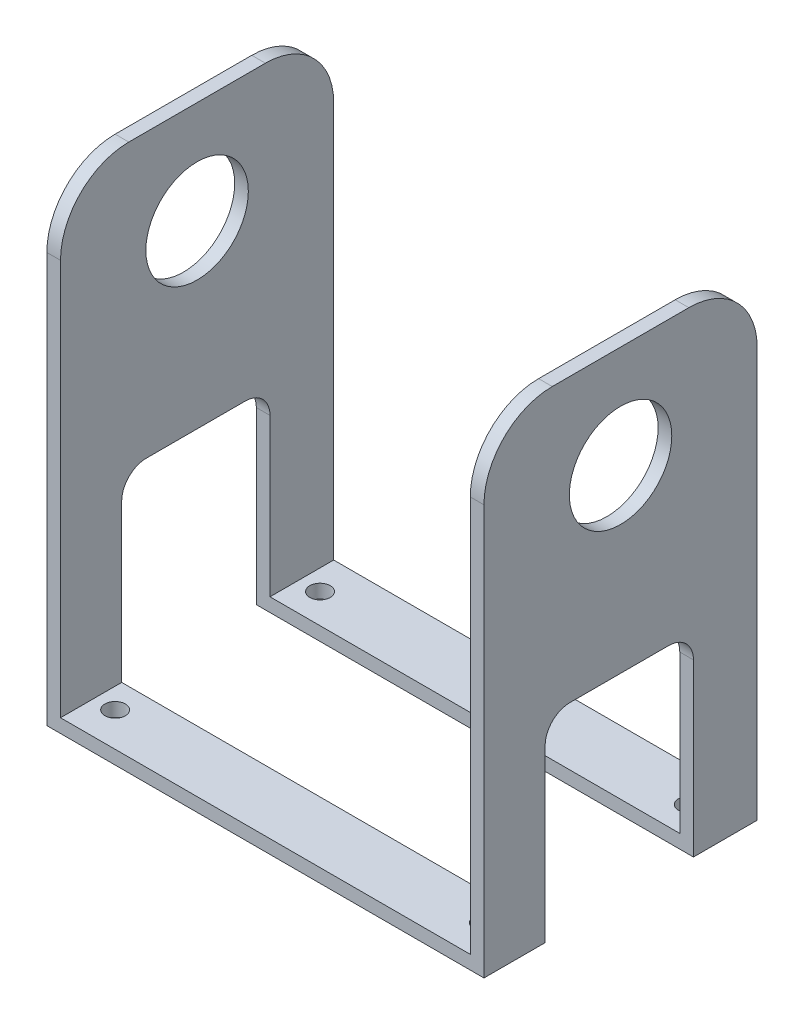
ISO-10303-21;
HEADER;
FILE_DESCRIPTION(('STEP AP214'),'2;1');
FILE_NAME('part.step','',(''),(''),'','','');
FILE_SCHEMA(('AUTOMOTIVE_DESIGN { 1 0 10303 214 1 1 1 1 }'));
ENDSEC;
DATA;
#1=APPLICATION_CONTEXT('core data for automotive mechanical design processes');
#2=APPLICATION_PROTOCOL_DEFINITION('international standard','automotive_design',2000,#1);
#3=PRODUCT_CONTEXT('',#1,'mechanical');
#4=PRODUCT('Part','Part','',(#3));
#5=PRODUCT_RELATED_PRODUCT_CATEGORY('part','',(#4));
#6=PRODUCT_DEFINITION_FORMATION('','',#4);
#7=PRODUCT_DEFINITION_CONTEXT('part definition',#1,'design');
#8=PRODUCT_DEFINITION('design','',#6,#7);
#9=PRODUCT_DEFINITION_SHAPE('','',#8);
#10=(LENGTH_UNIT() NAMED_UNIT(*) SI_UNIT(.MILLI.,.METRE.));
#11=(NAMED_UNIT(*) PLANE_ANGLE_UNIT() SI_UNIT($,.RADIAN.));
#12=(NAMED_UNIT(*) SI_UNIT($,.STERADIAN.) SOLID_ANGLE_UNIT());
#13=UNCERTAINTY_MEASURE_WITH_UNIT(LENGTH_MEASURE(1.E-05),#10,'distance_accuracy_value','');
#14=(GEOMETRIC_REPRESENTATION_CONTEXT(3) GLOBAL_UNCERTAINTY_ASSIGNED_CONTEXT((#13)) GLOBAL_UNIT_ASSIGNED_CONTEXT((#10,
#11,#12)) REPRESENTATION_CONTEXT('',''));
#15=CARTESIAN_POINT('',(0.,0.,0.));
#16=DIRECTION('',(0.,0.,1.));
#17=DIRECTION('',(1.,0.,0.));
#18=AXIS2_PLACEMENT_3D('',#15,#16,#17);
#19=CARTESIAN_POINT('',(0.,0.,40.));
#20=DIRECTION('',(-1.,0.,0.));
#21=DIRECTION('',(0.,0.,1.));
#22=AXIS2_PLACEMENT_3D('',#19,#20,#21);
#23=PLANE('',#22);
#24=CARTESIAN_POINT('',(0.,55.,20.));
#25=DIRECTION('',(1.,0.,0.));
#26=DIRECTION('',(0.,0.,-1.));
#27=AXIS2_PLACEMENT_3D('',#24,#25,#26);
#28=CIRCLE('',#27,7.5);
#29=CARTESIAN_POINT('',(0.,55.,12.5));
#30=VERTEX_POINT('',#29);
#31=EDGE_CURVE('E324',#30,#30,#28,.T.);
#32=ORIENTED_EDGE('',*,*,#31,.F.);
#33=EDGE_LOOP('',(#32));
#34=FACE_BOUND('',#33,.T.);
#35=DIRECTION('',(0.,1.,0.));
#36=VECTOR('',#35,1.);
#37=CARTESIAN_POINT('',(0.,0.,0.));
#38=LINE('',#37,#36);
#39=CARTESIAN_POINT('',(0.,0.,0.));
#40=VERTEX_POINT('',#39);
#41=CARTESIAN_POINT('',(0.,60.,0.));
#42=VERTEX_POINT('',#41);
#43=EDGE_CURVE('E339',#40,#42,#38,.T.);
#44=ORIENTED_EDGE('',*,*,#43,.T.);
#45=CARTESIAN_POINT('',(0.,60.,10.));
#46=DIRECTION('',(-1.,0.,0.));
#47=DIRECTION('',(0.,0.,1.));
#48=AXIS2_PLACEMENT_3D('',#45,#46,#47);
#49=CIRCLE('',#48,10.);
#50=CARTESIAN_POINT('',(0.,70.,10.));
#51=VERTEX_POINT('',#50);
#52=EDGE_CURVE('E381',#42,#51,#49,.F.);
#53=ORIENTED_EDGE('',*,*,#52,.T.);
#54=DIRECTION('',(0.,0.,-1.));
#55=VECTOR('',#54,1.);
#56=CARTESIAN_POINT('',(0.,70.,40.));
#57=LINE('',#56,#55);
#58=CARTESIAN_POINT('',(0.,70.,30.));
#59=VERTEX_POINT('',#58);
#60=EDGE_CURVE('E359',#59,#51,#57,.T.);
#61=ORIENTED_EDGE('',*,*,#60,.F.);
#62=CARTESIAN_POINT('',(0.,60.,30.));
#63=DIRECTION('',(-1.,0.,0.));
#64=DIRECTION('',(0.,0.,1.));
#65=AXIS2_PLACEMENT_3D('',#62,#63,#64);
#66=CIRCLE('',#65,10.);
#67=CARTESIAN_POINT('',(0.,60.,40.));
#68=VERTEX_POINT('',#67);
#69=EDGE_CURVE('E379',#59,#68,#66,.F.);
#70=ORIENTED_EDGE('',*,*,#69,.T.);
#71=DIRECTION('',(0.,1.,0.));
#72=VECTOR('',#71,1.);
#73=CARTESIAN_POINT('',(0.,0.,40.));
#74=LINE('',#73,#72);
#75=CARTESIAN_POINT('',(0.,0.,40.));
#76=VERTEX_POINT('',#75);
#77=EDGE_CURVE('E328',#76,#68,#74,.T.);
#78=ORIENTED_EDGE('',*,*,#77,.F.);
#79=DIRECTION('',(0.,0.,-1.));
#80=VECTOR('',#79,1.);
#81=CARTESIAN_POINT('',(0.,0.,40.));
#82=LINE('',#81,#80);
#83=CARTESIAN_POINT('',(0.,0.,31.0394527120361));
#84=VERTEX_POINT('',#83);
#85=EDGE_CURVE('E350',#76,#84,#82,.T.);
#86=ORIENTED_EDGE('',*,*,#85,.T.);
#87=DIRECTION('',(0.,1.,0.));
#88=VECTOR('',#87,1.);
#89=CARTESIAN_POINT('',(0.,0.,31.0394527120361));
#90=LINE('',#89,#88);
#91=CARTESIAN_POINT('',(0.,25.,31.0394527120361));
#92=VERTEX_POINT('',#91);
#93=EDGE_CURVE('E304',#84,#92,#90,.T.);
#94=ORIENTED_EDGE('',*,*,#93,.T.);
#95=CARTESIAN_POINT('',(0.,25.,27.4106744023088));
#96=DIRECTION('',(-1.,0.,0.));
#97=DIRECTION('',(0.,0.,1.));
#98=AXIS2_PLACEMENT_3D('',#95,#96,#97);
#99=CIRCLE('',#98,3.62877830972729);
#100=CARTESIAN_POINT('',(0.,28.6287783097273,27.4106744023088));
#101=VERTEX_POINT('',#100);
#102=EDGE_CURVE('E301',#92,#101,#99,.T.);
#103=ORIENTED_EDGE('',*,*,#102,.T.);
#104=DIRECTION('',(0.,0.,-1.));
#105=VECTOR('',#104,1.);
#106=CARTESIAN_POINT('',(0.,28.6287783097273,27.4106744023088));
#107=LINE('',#106,#105);
#108=CARTESIAN_POINT('',(0.,28.6287783097273,12.9564492245383));
#109=VERTEX_POINT('',#108);
#110=EDGE_CURVE('E298',#101,#109,#107,.T.);
#111=ORIENTED_EDGE('',*,*,#110,.T.);
#112=CARTESIAN_POINT('',(0.,25.,12.9564492245383));
#113=DIRECTION('',(-1.,0.,0.));
#114=DIRECTION('',(0.,0.,1.));
#115=AXIS2_PLACEMENT_3D('',#112,#113,#114);
#116=CIRCLE('',#115,3.62877830972729);
#117=CARTESIAN_POINT('',(0.,25.,9.32767091481105));
#118=VERTEX_POINT('',#117);
#119=EDGE_CURVE('E310',#109,#118,#116,.T.);
#120=ORIENTED_EDGE('',*,*,#119,.T.);
#121=DIRECTION('',(0.,-1.,0.));
#122=VECTOR('',#121,1.);
#123=CARTESIAN_POINT('',(0.,25.,9.32767091481105));
#124=LINE('',#123,#122);
#125=CARTESIAN_POINT('',(0.,0.,9.32767091481105));
#126=VERTEX_POINT('',#125);
#127=EDGE_CURVE('E307',#118,#126,#124,.T.);
#128=ORIENTED_EDGE('',*,*,#127,.T.);
#129=EDGE_CURVE('E338',#126,#40,#82,.T.);
#130=ORIENTED_EDGE('',*,*,#129,.T.);
#131=EDGE_LOOP('',(#44,#53,#61,#70,#78,#86,#94,#103,#111,#120,#128,#130));
#132=FACE_BOUND('',#131,.T.);
#133=ADVANCED_FACE('F32',(#34,#132),#23,.F.);
#134=CARTESIAN_POINT('',(-2.,0.,40.));
#135=DIRECTION('',(-1.,0.,0.));
#136=DIRECTION('',(0.,0.,1.));
#137=AXIS2_PLACEMENT_3D('',#134,#135,#136);
#138=PLANE('',#137);
#139=CARTESIAN_POINT('',(-2.,55.,20.));
#140=DIRECTION('',(-1.,0.,0.));
#141=DIRECTION('',(0.,0.,1.));
#142=AXIS2_PLACEMENT_3D('',#139,#140,#141);
#143=CIRCLE('',#142,7.5);
#144=CARTESIAN_POINT('',(-2.,55.,27.5));
#145=VERTEX_POINT('',#144);
#146=EDGE_CURVE('E327',#145,#145,#143,.T.);
#147=ORIENTED_EDGE('',*,*,#146,.F.);
#148=EDGE_LOOP('',(#147));
#149=FACE_BOUND('',#148,.T.);
#150=DIRECTION('',(0.,0.,-1.));
#151=VECTOR('',#150,1.);
#152=CARTESIAN_POINT('',(-2.,70.,40.));
#153=LINE('',#152,#151);
#154=CARTESIAN_POINT('',(-2.,70.,30.));
#155=VERTEX_POINT('',#154);
#156=CARTESIAN_POINT('',(-2.,70.,10.));
#157=VERTEX_POINT('',#156);
#158=EDGE_CURVE('E357',#155,#157,#153,.T.);
#159=ORIENTED_EDGE('',*,*,#158,.T.);
#160=CARTESIAN_POINT('',(-2.,60.,10.));
#161=DIRECTION('',(-1.,0.,0.));
#162=DIRECTION('',(0.,0.,1.));
#163=AXIS2_PLACEMENT_3D('',#160,#161,#162);
#164=CIRCLE('',#163,10.);
#165=CARTESIAN_POINT('',(-2.,60.,0.));
#166=VERTEX_POINT('',#165);
#167=EDGE_CURVE('E40',#157,#166,#164,.T.);
#168=ORIENTED_EDGE('',*,*,#167,.T.);
#169=DIRECTION('',(0.,1.,0.));
#170=VECTOR('',#169,1.);
#171=CARTESIAN_POINT('',(-2.,0.,0.));
#172=LINE('',#171,#170);
#173=CARTESIAN_POINT('',(-2.,2.,0.));
#174=VERTEX_POINT('',#173);
#175=EDGE_CURVE('E342',#174,#166,#172,.T.);
#176=ORIENTED_EDGE('',*,*,#175,.F.);
#177=DIRECTION('',(0.,0.,-1.));
#178=VECTOR('',#177,1.);
#179=CARTESIAN_POINT('',(-2.,2.,40.));
#180=LINE('',#179,#178);
#181=CARTESIAN_POINT('',(-2.,2.,9.32767091481105));
#182=VERTEX_POINT('',#181);
#183=EDGE_CURVE('E353',#182,#174,#180,.T.);
#184=ORIENTED_EDGE('',*,*,#183,.F.);
#185=DIRECTION('',(0.,1.,0.));
#186=VECTOR('',#185,1.);
#187=CARTESIAN_POINT('',(-2.,0.,9.32767091481105));
#188=LINE('',#187,#186);
#189=CARTESIAN_POINT('',(-2.,25.,9.32767091481105));
#190=VERTEX_POINT('',#189);
#191=EDGE_CURVE('E321',#182,#190,#188,.T.);
#192=ORIENTED_EDGE('',*,*,#191,.T.);
#193=CARTESIAN_POINT('',(-2.,25.,12.9564492245383));
#194=DIRECTION('',(-1.,0.,0.));
#195=DIRECTION('',(0.,0.,1.));
#196=AXIS2_PLACEMENT_3D('',#193,#194,#195);
#197=CIRCLE('',#196,3.62877830972729);
#198=CARTESIAN_POINT('',(-2.,28.6287783097273,12.9564492245383));
#199=VERTEX_POINT('',#198);
#200=EDGE_CURVE('E373',#190,#199,#197,.F.);
#201=ORIENTED_EDGE('',*,*,#200,.T.);
#202=DIRECTION('',(0.,0.,1.));
#203=VECTOR('',#202,1.);
#204=CARTESIAN_POINT('',(-2.,28.6287783097273,40.));
#205=LINE('',#204,#203);
#206=CARTESIAN_POINT('',(-2.,28.6287783097273,27.4106744023088));
#207=VERTEX_POINT('',#206);
#208=EDGE_CURVE('E367',#199,#207,#205,.T.);
#209=ORIENTED_EDGE('',*,*,#208,.T.);
#210=CARTESIAN_POINT('',(-2.,25.,27.4106744023088));
#211=DIRECTION('',(-1.,0.,0.));
#212=DIRECTION('',(0.,0.,1.));
#213=AXIS2_PLACEMENT_3D('',#210,#211,#212);
#214=CIRCLE('',#213,3.62877830972729);
#215=CARTESIAN_POINT('',(-2.,25.,31.0394527120361));
#216=VERTEX_POINT('',#215);
#217=EDGE_CURVE('E370',#207,#216,#214,.F.);
#218=ORIENTED_EDGE('',*,*,#217,.T.);
#219=DIRECTION('',(0.,-1.,0.));
#220=VECTOR('',#219,1.);
#221=CARTESIAN_POINT('',(-2.,0.,31.0394527120361));
#222=LINE('',#221,#220);
#223=CARTESIAN_POINT('',(-2.,2.,31.0394527120361));
#224=VERTEX_POINT('',#223);
#225=EDGE_CURVE('E315',#216,#224,#222,.T.);
#226=ORIENTED_EDGE('',*,*,#225,.T.);
#227=CARTESIAN_POINT('',(-2.,2.,40.));
#228=VERTEX_POINT('',#227);
#229=EDGE_CURVE('E354',#228,#224,#180,.T.);
#230=ORIENTED_EDGE('',*,*,#229,.F.);
#231=DIRECTION('',(0.,1.,0.));
#232=VECTOR('',#231,1.);
#233=CARTESIAN_POINT('',(-2.,0.,40.));
#234=LINE('',#233,#232);
#235=CARTESIAN_POINT('',(-2.,60.,40.));
#236=VERTEX_POINT('',#235);
#237=EDGE_CURVE('E330',#228,#236,#234,.T.);
#238=ORIENTED_EDGE('',*,*,#237,.T.);
#239=CARTESIAN_POINT('',(-2.,60.,30.));
#240=DIRECTION('',(-1.,0.,0.));
#241=DIRECTION('',(0.,0.,1.));
#242=AXIS2_PLACEMENT_3D('',#239,#240,#241);
#243=CIRCLE('',#242,10.);
#244=EDGE_CURVE('E387',#236,#155,#243,.T.);
#245=ORIENTED_EDGE('',*,*,#244,.T.);
#246=EDGE_LOOP('',(#159,#168,#176,#184,#192,#201,#209,#218,#226,#230,#238,#245));
#247=FACE_BOUND('',#246,.T.);
#248=ADVANCED_FACE('F391',(#149,#247),#138,.T.);
#249=CARTESIAN_POINT('',(-32.,2.,40.));
#250=DIRECTION('',(0.,1.,0.));
#251=DIRECTION('',(0.,0.,1.));
#252=AXIS2_PLACEMENT_3D('',#249,#250,#251);
#253=PLANE('',#252);
#254=CARTESIAN_POINT('',(-59.,2.,5.));
#255=DIRECTION('',(0.,1.,0.));
#256=DIRECTION('',(0.,0.,1.));
#257=AXIS2_PLACEMENT_3D('',#254,#255,#256);
#258=CIRCLE('',#257,1.5);
#259=CARTESIAN_POINT('',(-59.,2.,6.50000000000001));
#260=VERTEX_POINT('',#259);
#261=EDGE_CURVE('E759',#260,#260,#258,.T.);
#262=ORIENTED_EDGE('',*,*,#261,.F.);
#263=EDGE_LOOP('',(#262));
#264=FACE_BOUND('',#263,.T.);
#265=CARTESIAN_POINT('',(-5.,2.,5.));
#266=DIRECTION('',(0.,1.,0.));
#267=DIRECTION('',(0.,0.,1.));
#268=AXIS2_PLACEMENT_3D('',#265,#266,#267);
#269=CIRCLE('',#268,1.5);
#270=CARTESIAN_POINT('',(-5.,2.,6.5));
#271=VERTEX_POINT('',#270);
#272=EDGE_CURVE('E769',#271,#271,#269,.T.);
#273=ORIENTED_EDGE('',*,*,#272,.F.);
#274=EDGE_LOOP('',(#273));
#275=FACE_BOUND('',#274,.T.);
#276=DIRECTION('',(1.,0.,0.));
#277=VECTOR('',#276,1.);
#278=CARTESIAN_POINT('',(-32.,2.,0.));
#279=LINE('',#278,#277);
#280=CARTESIAN_POINT('',(-62.,2.,0.));
#281=VERTEX_POINT('',#280);
#282=EDGE_CURVE('E345',#281,#174,#279,.T.);
#283=ORIENTED_EDGE('',*,*,#282,.F.);
#284=DIRECTION('',(0.,0.,-1.));
#285=VECTOR('',#284,1.);
#286=CARTESIAN_POINT('',(-62.,2.,40.));
#287=LINE('',#286,#285);
#288=CARTESIAN_POINT('',(-62.,2.,9.32767091481105));
#289=VERTEX_POINT('',#288);
#290=EDGE_CURVE('E252',#289,#281,#287,.T.);
#291=ORIENTED_EDGE('',*,*,#290,.F.);
#292=DIRECTION('',(1.,0.,0.));
#293=VECTOR('',#292,1.);
#294=CARTESIAN_POINT('',(-32.,2.,9.32767091481105));
#295=LINE('',#294,#293);
#296=EDGE_CURVE('E318',#289,#182,#295,.T.);
#297=ORIENTED_EDGE('',*,*,#296,.T.);
#298=ORIENTED_EDGE('',*,*,#183,.T.);
#299=EDGE_LOOP('',(#283,#291,#297,#298));
#300=FACE_BOUND('',#299,.T.);
#301=ADVANCED_FACE('F450',(#264,#275,#300),#253,.T.);
#302=CARTESIAN_POINT('',(-5.,2.,35.));
#303=DIRECTION('',(0.,1.,0.));
#304=DIRECTION('',(0.,0.,1.));
#305=AXIS2_PLACEMENT_3D('',#302,#303,#304);
#306=CIRCLE('',#305,1.5);
#307=CARTESIAN_POINT('',(-5.,2.,36.5));
#308=VERTEX_POINT('',#307);
#309=EDGE_CURVE('E775',#308,#308,#306,.T.);
#310=ORIENTED_EDGE('',*,*,#309,.F.);
#311=EDGE_LOOP('',(#310));
#312=FACE_BOUND('',#311,.T.);
#313=CARTESIAN_POINT('',(-59.,2.,35.));
#314=DIRECTION('',(0.,1.,0.));
#315=DIRECTION('',(0.,0.,1.));
#316=AXIS2_PLACEMENT_3D('',#313,#314,#315);
#317=CIRCLE('',#316,1.5);
#318=CARTESIAN_POINT('',(-59.,2.,36.5));
#319=VERTEX_POINT('',#318);
#320=EDGE_CURVE('E781',#319,#319,#317,.T.);
#321=ORIENTED_EDGE('',*,*,#320,.F.);
#322=EDGE_LOOP('',(#321));
#323=FACE_BOUND('',#322,.T.);
#324=ORIENTED_EDGE('',*,*,#229,.T.);
#325=DIRECTION('',(-1.,0.,0.));
#326=VECTOR('',#325,1.);
#327=CARTESIAN_POINT('',(-32.,2.,31.0394527120361));
#328=LINE('',#327,#326);
#329=CARTESIAN_POINT('',(-62.,2.,31.0394527120361));
#330=VERTEX_POINT('',#329);
#331=EDGE_CURVE('E313',#224,#330,#328,.T.);
#332=ORIENTED_EDGE('',*,*,#331,.T.);
#333=CARTESIAN_POINT('',(-62.,2.,40.));
#334=VERTEX_POINT('',#333);
#335=EDGE_CURVE('E253',#334,#330,#287,.T.);
#336=ORIENTED_EDGE('',*,*,#335,.F.);
#337=DIRECTION('',(1.,0.,0.));
#338=VECTOR('',#337,1.);
#339=CARTESIAN_POINT('',(-32.,2.,40.));
#340=LINE('',#339,#338);
#341=EDGE_CURVE('E333',#334,#228,#340,.T.);
#342=ORIENTED_EDGE('',*,*,#341,.T.);
#343=EDGE_LOOP('',(#324,#332,#336,#342));
#344=FACE_BOUND('',#343,.T.);
#345=ADVANCED_FACE('F470',(#312,#323,#344),#253,.T.);
#346=CARTESIAN_POINT('',(-32.,0.,40.));
#347=DIRECTION('',(0.,1.,0.));
#348=DIRECTION('',(0.,0.,1.));
#349=AXIS2_PLACEMENT_3D('',#346,#347,#348);
#350=PLANE('',#349);
#351=CARTESIAN_POINT('',(-59.,0.,5.));
#352=DIRECTION('',(0.,-1.,0.));
#353=DIRECTION('',(0.,0.,-1.));
#354=AXIS2_PLACEMENT_3D('',#351,#352,#353);
#355=CIRCLE('',#354,1.5);
#356=CARTESIAN_POINT('',(-59.,0.,3.5));
#357=VERTEX_POINT('',#356);
#358=EDGE_CURVE('E762',#357,#357,#355,.T.);
#359=ORIENTED_EDGE('',*,*,#358,.F.);
#360=EDGE_LOOP('',(#359));
#361=FACE_BOUND('',#360,.T.);
#362=CARTESIAN_POINT('',(-5.,0.,5.));
#363=DIRECTION('',(0.,-1.,0.));
#364=DIRECTION('',(0.,0.,-1.));
#365=AXIS2_PLACEMENT_3D('',#362,#363,#364);
#366=CIRCLE('',#365,1.5);
#367=CARTESIAN_POINT('',(-5.,0.,3.5));
#368=VERTEX_POINT('',#367);
#369=EDGE_CURVE('E764',#368,#368,#366,.T.);
#370=ORIENTED_EDGE('',*,*,#369,.F.);
#371=EDGE_LOOP('',(#370));
#372=FACE_BOUND('',#371,.T.);
#373=DIRECTION('',(1.,0.,0.));
#374=VECTOR('',#373,1.);
#375=CARTESIAN_POINT('',(-32.,0.,9.32767091481105));
#376=LINE('',#375,#374);
#377=CARTESIAN_POINT('',(-64.,0.,9.32767091481105));
#378=VERTEX_POINT('',#377);
#379=EDGE_CURVE('E365',#378,#126,#376,.T.);
#380=ORIENTED_EDGE('',*,*,#379,.F.);
#381=DIRECTION('',(0.,0.,-1.));
#382=VECTOR('',#381,1.);
#383=CARTESIAN_POINT('',(-64.,0.,40.));
#384=LINE('',#383,#382);
#385=CARTESIAN_POINT('',(-64.,0.,0.));
#386=VERTEX_POINT('',#385);
#387=EDGE_CURVE('E243',#378,#386,#384,.T.);
#388=ORIENTED_EDGE('',*,*,#387,.T.);
#389=DIRECTION('',(1.,0.,0.));
#390=VECTOR('',#389,1.);
#391=CARTESIAN_POINT('',(-32.,0.,0.));
#392=LINE('',#391,#390);
#393=EDGE_CURVE('E331',#386,#40,#392,.T.);
#394=ORIENTED_EDGE('',*,*,#393,.T.);
#395=ORIENTED_EDGE('',*,*,#129,.F.);
#396=EDGE_LOOP('',(#380,#388,#394,#395));
#397=FACE_BOUND('',#396,.T.);
#398=ADVANCED_FACE('F436',(#361,#372,#397),#350,.F.);
#399=CARTESIAN_POINT('',(-5.,0.,35.));
#400=DIRECTION('',(0.,-1.,0.));
#401=DIRECTION('',(0.,0.,-1.));
#402=AXIS2_PLACEMENT_3D('',#399,#400,#401);
#403=CIRCLE('',#402,1.5);
#404=CARTESIAN_POINT('',(-5.,0.,33.5));
#405=VERTEX_POINT('',#404);
#406=EDGE_CURVE('E772',#405,#405,#403,.T.);
#407=ORIENTED_EDGE('',*,*,#406,.F.);
#408=EDGE_LOOP('',(#407));
#409=FACE_BOUND('',#408,.T.);
#410=CARTESIAN_POINT('',(-59.,0.,35.));
#411=DIRECTION('',(0.,-1.,0.));
#412=DIRECTION('',(0.,0.,-1.));
#413=AXIS2_PLACEMENT_3D('',#410,#411,#412);
#414=CIRCLE('',#413,1.5);
#415=CARTESIAN_POINT('',(-59.,0.,33.5));
#416=VERTEX_POINT('',#415);
#417=EDGE_CURVE('E778',#416,#416,#414,.T.);
#418=ORIENTED_EDGE('',*,*,#417,.F.);
#419=EDGE_LOOP('',(#418));
#420=FACE_BOUND('',#419,.T.);
#421=DIRECTION('',(-1.,0.,0.));
#422=VECTOR('',#421,1.);
#423=CARTESIAN_POINT('',(-32.,0.,31.0394527120361));
#424=LINE('',#423,#422);
#425=CARTESIAN_POINT('',(-64.,0.,31.0394527120361));
#426=VERTEX_POINT('',#425);
#427=EDGE_CURVE('E361',#84,#426,#424,.T.);
#428=ORIENTED_EDGE('',*,*,#427,.F.);
#429=ORIENTED_EDGE('',*,*,#85,.F.);
#430=DIRECTION('',(1.,0.,0.));
#431=VECTOR('',#430,1.);
#432=CARTESIAN_POINT('',(-32.,0.,40.));
#433=LINE('',#432,#431);
#434=CARTESIAN_POINT('',(-64.,0.,40.));
#435=VERTEX_POINT('',#434);
#436=EDGE_CURVE('E336',#435,#76,#433,.T.);
#437=ORIENTED_EDGE('',*,*,#436,.F.);
#438=EDGE_CURVE('E249',#435,#426,#384,.T.);
#439=ORIENTED_EDGE('',*,*,#438,.T.);
#440=EDGE_LOOP('',(#428,#429,#437,#439));
#441=FACE_BOUND('',#440,.T.);
#442=ADVANCED_FACE('F413',(#409,#420,#441),#350,.F.);
#443=CARTESIAN_POINT('',(-2.,70.,40.));
#444=DIRECTION('',(0.,1.,0.));
#445=DIRECTION('',(0.,0.,1.));
#446=AXIS2_PLACEMENT_3D('',#443,#444,#445);
#447=PLANE('',#446);
#448=ORIENTED_EDGE('',*,*,#60,.T.);
#449=DIRECTION('',(1.,0.,0.));
#450=VECTOR('',#449,1.);
#451=CARTESIAN_POINT('',(-2.,70.,10.));
#452=LINE('',#451,#450);
#453=EDGE_CURVE('E53',#51,#157,#452,.F.);
#454=ORIENTED_EDGE('',*,*,#453,.T.);
#455=ORIENTED_EDGE('',*,*,#158,.F.);
#456=DIRECTION('',(1.,0.,0.));
#457=VECTOR('',#456,1.);
#458=CARTESIAN_POINT('',(0.,70.,30.));
#459=LINE('',#458,#457);
#460=EDGE_CURVE('E383',#155,#59,#459,.T.);
#461=ORIENTED_EDGE('',*,*,#460,.T.);
#462=EDGE_LOOP('',(#448,#454,#455,#461));
#463=FACE_BOUND('',#462,.T.);
#464=ADVANCED_FACE('F402',(#463),#447,.T.);
#465=CARTESIAN_POINT('',(0.,0.,40.));
#466=DIRECTION('',(0.,0.,-1.));
#467=DIRECTION('',(-1.,0.,0.));
#468=AXIS2_PLACEMENT_3D('',#465,#466,#467);
#469=PLANE('',#468);
#470=ORIENTED_EDGE('',*,*,#77,.T.);
#471=DIRECTION('',(1.,0.,0.));
#472=VECTOR('',#471,1.);
#473=CARTESIAN_POINT('',(-2.,60.,40.));
#474=LINE('',#473,#472);
#475=EDGE_CURVE('E11',#68,#236,#474,.F.);
#476=ORIENTED_EDGE('',*,*,#475,.T.);
#477=ORIENTED_EDGE('',*,*,#237,.F.);
#478=ORIENTED_EDGE('',*,*,#341,.F.);
#479=DIRECTION('',(0.,1.,0.));
#480=VECTOR('',#479,1.);
#481=CARTESIAN_POINT('',(-62.,0.,40.));
#482=LINE('',#481,#480);
#483=CARTESIAN_POINT('',(-62.,60.,40.));
#484=VERTEX_POINT('',#483);
#485=EDGE_CURVE('E239',#334,#484,#482,.T.);
#486=ORIENTED_EDGE('',*,*,#485,.T.);
#487=DIRECTION('',(-1.,0.,0.));
#488=VECTOR('',#487,1.);
#489=CARTESIAN_POINT('',(-62.,60.,40.));
#490=LINE('',#489,#488);
#491=CARTESIAN_POINT('',(-64.,60.,40.));
#492=VERTEX_POINT('',#491);
#493=EDGE_CURVE('E288',#492,#484,#490,.F.);
#494=ORIENTED_EDGE('',*,*,#493,.F.);
#495=DIRECTION('',(0.,1.,0.));
#496=VECTOR('',#495,1.);
#497=CARTESIAN_POINT('',(-64.,0.,40.));
#498=LINE('',#497,#496);
#499=EDGE_CURVE('E236',#435,#492,#498,.T.);
#500=ORIENTED_EDGE('',*,*,#499,.F.);
#501=ORIENTED_EDGE('',*,*,#436,.T.);
#502=EDGE_LOOP('',(#470,#476,#477,#478,#486,#494,#500,#501));
#503=FACE_BOUND('',#502,.T.);
#504=ADVANCED_FACE('F407',(#503),#469,.F.);
#505=CARTESIAN_POINT('',(0.,0.,0.));
#506=DIRECTION('',(0.,0.,-1.));
#507=DIRECTION('',(-1.,0.,0.));
#508=AXIS2_PLACEMENT_3D('',#505,#506,#507);
#509=PLANE('',#508);
#510=ORIENTED_EDGE('',*,*,#175,.T.);
#511=DIRECTION('',(1.,0.,0.));
#512=VECTOR('',#511,1.);
#513=CARTESIAN_POINT('',(0.,60.,0.));
#514=LINE('',#513,#512);
#515=EDGE_CURVE('E376',#166,#42,#514,.T.);
#516=ORIENTED_EDGE('',*,*,#515,.T.);
#517=ORIENTED_EDGE('',*,*,#43,.F.);
#518=ORIENTED_EDGE('',*,*,#393,.F.);
#519=DIRECTION('',(0.,1.,0.));
#520=VECTOR('',#519,1.);
#521=CARTESIAN_POINT('',(-64.,0.,0.));
#522=LINE('',#521,#520);
#523=CARTESIAN_POINT('',(-64.,60.,0.));
#524=VERTEX_POINT('',#523);
#525=EDGE_CURVE('E244',#386,#524,#522,.T.);
#526=ORIENTED_EDGE('',*,*,#525,.T.);
#527=DIRECTION('',(-1.,0.,0.));
#528=VECTOR('',#527,1.);
#529=CARTESIAN_POINT('',(-64.,60.,0.));
#530=LINE('',#529,#528);
#531=CARTESIAN_POINT('',(-62.,60.,0.));
#532=VERTEX_POINT('',#531);
#533=EDGE_CURVE('E270',#532,#524,#530,.T.);
#534=ORIENTED_EDGE('',*,*,#533,.F.);
#535=DIRECTION('',(0.,1.,0.));
#536=VECTOR('',#535,1.);
#537=CARTESIAN_POINT('',(-62.,0.,0.));
#538=LINE('',#537,#536);
#539=EDGE_CURVE('E240',#281,#532,#538,.T.);
#540=ORIENTED_EDGE('',*,*,#539,.F.);
#541=ORIENTED_EDGE('',*,*,#282,.T.);
#542=EDGE_LOOP('',(#510,#516,#517,#518,#526,#534,#540,#541));
#543=FACE_BOUND('',#542,.T.);
#544=ADVANCED_FACE('F396',(#543),#509,.T.);
#545=CARTESIAN_POINT('',(-60.,55.,20.));
#546=DIRECTION('',(1.,0.,0.));
#547=DIRECTION('',(0.,0.,-1.));
#548=AXIS2_PLACEMENT_3D('',#545,#546,#547);
#549=CYLINDRICAL_SURFACE('',#548,7.5);
#550=ORIENTED_EDGE('',*,*,#146,.T.);
#551=EDGE_LOOP('',(#550));
#552=FACE_BOUND('',#551,.T.);
#553=ORIENTED_EDGE('',*,*,#31,.T.);
#554=EDGE_LOOP('',(#553));
#555=FACE_BOUND('',#554,.T.);
#556=ADVANCED_FACE('F505',(#552,#555),#549,.F.);
#557=CARTESIAN_POINT('',(-60.,25.,12.9564492245383));
#558=DIRECTION('',(1.,0.,0.));
#559=DIRECTION('',(0.,0.,-1.));
#560=AXIS2_PLACEMENT_3D('',#557,#558,#559);
#561=CYLINDRICAL_SURFACE('',#560,3.62877830972729);
#562=DIRECTION('',(1.,0.,0.));
#563=VECTOR('',#562,1.);
#564=CARTESIAN_POINT('',(-60.,25.,9.32767091481105));
#565=LINE('',#564,#563);
#566=EDGE_CURVE('E290',#190,#118,#565,.T.);
#567=ORIENTED_EDGE('',*,*,#566,.T.);
#568=ORIENTED_EDGE('',*,*,#119,.F.);
#569=DIRECTION('',(1.,0.,0.));
#570=VECTOR('',#569,1.);
#571=CARTESIAN_POINT('',(-60.,28.6287783097273,12.9564492245383));
#572=LINE('',#571,#570);
#573=EDGE_CURVE('E296',#199,#109,#572,.T.);
#574=ORIENTED_EDGE('',*,*,#573,.F.);
#575=ORIENTED_EDGE('',*,*,#200,.F.);
#576=EDGE_LOOP('',(#567,#568,#574,#575));
#577=FACE_BOUND('',#576,.T.);
#578=ADVANCED_FACE('F430',(#577),#561,.F.);
#579=CARTESIAN_POINT('',(-60.,25.,9.32767091481105));
#580=DIRECTION('',(0.,0.,1.));
#581=DIRECTION('',(0.,-1.,0.));
#582=AXIS2_PLACEMENT_3D('',#579,#580,#581);
#583=PLANE('',#582);
#584=ORIENTED_EDGE('',*,*,#296,.F.);
#585=DIRECTION('',(0.,1.,0.));
#586=VECTOR('',#585,1.);
#587=CARTESIAN_POINT('',(-62.,0.,9.32767091481105));
#588=LINE('',#587,#586);
#589=CARTESIAN_POINT('',(-62.,25.,9.32767091481105));
#590=VERTEX_POINT('',#589);
#591=EDGE_CURVE('E224',#289,#590,#588,.T.);
#592=ORIENTED_EDGE('',*,*,#591,.T.);
#593=DIRECTION('',(-1.,0.,0.));
#594=VECTOR('',#593,1.);
#595=CARTESIAN_POINT('',(-4.,25.,9.32767091481105));
#596=LINE('',#595,#594);
#597=CARTESIAN_POINT('',(-64.,25.,9.32767091481105));
#598=VERTEX_POINT('',#597);
#599=EDGE_CURVE('E451',#590,#598,#596,.T.);
#600=ORIENTED_EDGE('',*,*,#599,.T.);
#601=DIRECTION('',(0.,-1.,0.));
#602=VECTOR('',#601,1.);
#603=CARTESIAN_POINT('',(-64.,25.,9.32767091481105));
#604=LINE('',#603,#602);
#605=EDGE_CURVE('E220',#598,#378,#604,.T.);
#606=ORIENTED_EDGE('',*,*,#605,.T.);
#607=ORIENTED_EDGE('',*,*,#379,.T.);
#608=ORIENTED_EDGE('',*,*,#127,.F.);
#609=ORIENTED_EDGE('',*,*,#566,.F.);
#610=ORIENTED_EDGE('',*,*,#191,.F.);
#611=EDGE_LOOP('',(#584,#592,#600,#606,#607,#608,#609,#610));
#612=FACE_BOUND('',#611,.T.);
#613=ADVANCED_FACE('F433',(#612),#583,.T.);
#614=CARTESIAN_POINT('',(-60.,0.,31.0394527120361));
#615=DIRECTION('',(0.,0.,-1.));
#616=DIRECTION('',(0.,1.,0.));
#617=AXIS2_PLACEMENT_3D('',#614,#615,#616);
#618=PLANE('',#617);
#619=DIRECTION('',(1.,0.,0.));
#620=VECTOR('',#619,1.);
#621=CARTESIAN_POINT('',(-60.,25.,31.0394527120361));
#622=LINE('',#621,#620);
#623=EDGE_CURVE('E292',#216,#92,#622,.T.);
#624=ORIENTED_EDGE('',*,*,#623,.T.);
#625=ORIENTED_EDGE('',*,*,#93,.F.);
#626=ORIENTED_EDGE('',*,*,#427,.T.);
#627=DIRECTION('',(0.,1.,0.));
#628=VECTOR('',#627,1.);
#629=CARTESIAN_POINT('',(-64.,0.,31.0394527120361));
#630=LINE('',#629,#628);
#631=CARTESIAN_POINT('',(-64.,25.,31.0394527120361));
#632=VERTEX_POINT('',#631);
#633=EDGE_CURVE('E226',#426,#632,#630,.T.);
#634=ORIENTED_EDGE('',*,*,#633,.T.);
#635=DIRECTION('',(-1.,0.,0.));
#636=VECTOR('',#635,1.);
#637=CARTESIAN_POINT('',(-4.,25.,31.0394527120361));
#638=LINE('',#637,#636);
#639=CARTESIAN_POINT('',(-62.,25.,31.0394527120361));
#640=VERTEX_POINT('',#639);
#641=EDGE_CURVE('E456',#640,#632,#638,.T.);
#642=ORIENTED_EDGE('',*,*,#641,.F.);
#643=DIRECTION('',(0.,-1.,0.));
#644=VECTOR('',#643,1.);
#645=CARTESIAN_POINT('',(-62.,0.,31.0394527120361));
#646=LINE('',#645,#644);
#647=EDGE_CURVE('E221',#640,#330,#646,.T.);
#648=ORIENTED_EDGE('',*,*,#647,.T.);
#649=ORIENTED_EDGE('',*,*,#331,.F.);
#650=ORIENTED_EDGE('',*,*,#225,.F.);
#651=EDGE_LOOP('',(#624,#625,#626,#634,#642,#648,#649,#650));
#652=FACE_BOUND('',#651,.T.);
#653=ADVANCED_FACE('F416',(#652),#618,.T.);
#654=CARTESIAN_POINT('',(-60.,25.,27.4106744023088));
#655=DIRECTION('',(1.,0.,0.));
#656=DIRECTION('',(0.,0.,-1.));
#657=AXIS2_PLACEMENT_3D('',#654,#655,#656);
#658=CYLINDRICAL_SURFACE('',#657,3.62877830972729);
#659=DIRECTION('',(1.,0.,0.));
#660=VECTOR('',#659,1.);
#661=CARTESIAN_POINT('',(-60.,28.6287783097273,27.4106744023088));
#662=LINE('',#661,#660);
#663=EDGE_CURVE('E294',#207,#101,#662,.T.);
#664=ORIENTED_EDGE('',*,*,#663,.T.);
#665=ORIENTED_EDGE('',*,*,#102,.F.);
#666=ORIENTED_EDGE('',*,*,#623,.F.);
#667=ORIENTED_EDGE('',*,*,#217,.F.);
#668=EDGE_LOOP('',(#664,#665,#666,#667));
#669=FACE_BOUND('',#668,.T.);
#670=ADVANCED_FACE('F420',(#669),#658,.F.);
#671=CARTESIAN_POINT('',(-60.,28.6287783097273,27.4106744023088));
#672=DIRECTION('',(0.,-1.,0.));
#673=DIRECTION('',(0.,0.,-1.));
#674=AXIS2_PLACEMENT_3D('',#671,#672,#673);
#675=PLANE('',#674);
#676=ORIENTED_EDGE('',*,*,#573,.T.);
#677=ORIENTED_EDGE('',*,*,#110,.F.);
#678=ORIENTED_EDGE('',*,*,#663,.F.);
#679=ORIENTED_EDGE('',*,*,#208,.F.);
#680=EDGE_LOOP('',(#676,#677,#678,#679));
#681=FACE_BOUND('',#680,.T.);
#682=ADVANCED_FACE('F424',(#681),#675,.T.);
#683=CARTESIAN_POINT('',(0.,60.,10.));
#684=DIRECTION('',(1.,0.,0.));
#685=DIRECTION('',(0.,0.,-1.));
#686=AXIS2_PLACEMENT_3D('',#683,#684,#685);
#687=CYLINDRICAL_SURFACE('',#686,10.);
#688=ORIENTED_EDGE('',*,*,#167,.F.);
#689=ORIENTED_EDGE('',*,*,#453,.F.);
#690=ORIENTED_EDGE('',*,*,#52,.F.);
#691=ORIENTED_EDGE('',*,*,#515,.F.);
#692=EDGE_LOOP('',(#688,#689,#690,#691));
#693=FACE_BOUND('',#692,.T.);
#694=ADVANCED_FACE('F399',(#693),#687,.T.);
#695=CARTESIAN_POINT('',(-2.,60.,30.));
#696=DIRECTION('',(-1.,0.,0.));
#697=DIRECTION('',(0.,0.,1.));
#698=AXIS2_PLACEMENT_3D('',#695,#696,#697);
#699=CYLINDRICAL_SURFACE('',#698,10.);
#700=ORIENTED_EDGE('',*,*,#244,.F.);
#701=ORIENTED_EDGE('',*,*,#475,.F.);
#702=ORIENTED_EDGE('',*,*,#69,.F.);
#703=ORIENTED_EDGE('',*,*,#460,.F.);
#704=EDGE_LOOP('',(#700,#701,#702,#703));
#705=FACE_BOUND('',#704,.T.);
#706=ADVANCED_FACE('F34',(#705),#699,.T.);
#707=CARTESIAN_POINT('',(-64.,0.,40.));
#708=DIRECTION('',(1.,0.,0.));
#709=DIRECTION('',(0.,0.,1.));
#710=AXIS2_PLACEMENT_3D('',#707,#708,#709);
#711=PLANE('',#710);
#712=CARTESIAN_POINT('',(-64.,55.,20.));
#713=DIRECTION('',(1.,0.,0.));
#714=DIRECTION('',(0.,0.,-1.));
#715=AXIS2_PLACEMENT_3D('',#712,#713,#714);
#716=CIRCLE('',#715,7.5);
#717=CARTESIAN_POINT('',(-64.,55.,12.5));
#718=VERTEX_POINT('',#717);
#719=EDGE_CURVE('E232',#718,#718,#716,.T.);
#720=ORIENTED_EDGE('',*,*,#719,.T.);
#721=EDGE_LOOP('',(#720));
#722=FACE_BOUND('',#721,.T.);
#723=ORIENTED_EDGE('',*,*,#525,.F.);
#724=ORIENTED_EDGE('',*,*,#387,.F.);
#725=ORIENTED_EDGE('',*,*,#605,.F.);
#726=CARTESIAN_POINT('',(-64.,25.,12.9564492245383));
#727=DIRECTION('',(-1.,0.,0.));
#728=DIRECTION('',(0.,0.,1.));
#729=AXIS2_PLACEMENT_3D('',#726,#727,#728);
#730=CIRCLE('',#729,3.62877830972729);
#731=CARTESIAN_POINT('',(-64.,28.6287783097273,12.9564492245383));
#732=VERTEX_POINT('',#731);
#733=EDGE_CURVE('E199',#732,#598,#730,.T.);
#734=ORIENTED_EDGE('',*,*,#733,.F.);
#735=DIRECTION('',(0.,0.,-1.));
#736=VECTOR('',#735,1.);
#737=CARTESIAN_POINT('',(-64.,28.6287783097273,27.4106744023088));
#738=LINE('',#737,#736);
#739=CARTESIAN_POINT('',(-64.,28.6287783097273,27.4106744023088));
#740=VERTEX_POINT('',#739);
#741=EDGE_CURVE('E206',#740,#732,#738,.T.);
#742=ORIENTED_EDGE('',*,*,#741,.F.);
#743=CARTESIAN_POINT('',(-64.,25.,27.4106744023088));
#744=DIRECTION('',(-1.,0.,0.));
#745=DIRECTION('',(0.,0.,1.));
#746=AXIS2_PLACEMENT_3D('',#743,#744,#745);
#747=CIRCLE('',#746,3.62877830972729);
#748=EDGE_CURVE('E214',#632,#740,#747,.T.);
#749=ORIENTED_EDGE('',*,*,#748,.F.);
#750=ORIENTED_EDGE('',*,*,#633,.F.);
#751=ORIENTED_EDGE('',*,*,#438,.F.);
#752=ORIENTED_EDGE('',*,*,#499,.T.);
#753=CARTESIAN_POINT('',(-64.,60.,30.));
#754=DIRECTION('',(-1.,0.,0.));
#755=DIRECTION('',(0.,0.,1.));
#756=AXIS2_PLACEMENT_3D('',#753,#754,#755);
#757=CIRCLE('',#756,10.);
#758=CARTESIAN_POINT('',(-64.,70.,30.));
#759=VERTEX_POINT('',#758);
#760=EDGE_CURVE('E272',#759,#492,#757,.F.);
#761=ORIENTED_EDGE('',*,*,#760,.F.);
#762=DIRECTION('',(0.,0.,-1.));
#763=VECTOR('',#762,1.);
#764=CARTESIAN_POINT('',(-64.,70.,40.));
#765=LINE('',#764,#763);
#766=CARTESIAN_POINT('',(-64.,70.,10.));
#767=VERTEX_POINT('',#766);
#768=EDGE_CURVE('E259',#759,#767,#765,.T.);
#769=ORIENTED_EDGE('',*,*,#768,.T.);
#770=CARTESIAN_POINT('',(-64.,60.,10.));
#771=DIRECTION('',(-1.,0.,0.));
#772=DIRECTION('',(0.,0.,1.));
#773=AXIS2_PLACEMENT_3D('',#770,#771,#772);
#774=CIRCLE('',#773,10.);
#775=EDGE_CURVE('E275',#524,#767,#774,.F.);
#776=ORIENTED_EDGE('',*,*,#775,.F.);
#777=EDGE_LOOP('',(#723,#724,#725,#734,#742,#749,#750,#751,#752,#761,#769,#776));
#778=FACE_BOUND('',#777,.T.);
#779=ADVANCED_FACE('F217',(#722,#778),#711,.F.);
#780=CARTESIAN_POINT('',(-62.,0.,40.));
#781=DIRECTION('',(1.,0.,0.));
#782=DIRECTION('',(0.,0.,1.));
#783=AXIS2_PLACEMENT_3D('',#780,#781,#782);
#784=PLANE('',#783);
#785=CARTESIAN_POINT('',(-62.,55.,20.));
#786=DIRECTION('',(-1.,0.,0.));
#787=DIRECTION('',(0.,0.,1.));
#788=AXIS2_PLACEMENT_3D('',#785,#786,#787);
#789=CIRCLE('',#788,7.5);
#790=CARTESIAN_POINT('',(-62.,55.,27.5));
#791=VERTEX_POINT('',#790);
#792=EDGE_CURVE('E235',#791,#791,#789,.T.);
#793=ORIENTED_EDGE('',*,*,#792,.T.);
#794=EDGE_LOOP('',(#793));
#795=FACE_BOUND('',#794,.T.);
#796=DIRECTION('',(0.,0.,-1.));
#797=VECTOR('',#796,1.);
#798=CARTESIAN_POINT('',(-62.,70.,40.));
#799=LINE('',#798,#797);
#800=CARTESIAN_POINT('',(-62.,70.,30.));
#801=VERTEX_POINT('',#800);
#802=CARTESIAN_POINT('',(-62.,70.,10.));
#803=VERTEX_POINT('',#802);
#804=EDGE_CURVE('E256',#801,#803,#799,.T.);
#805=ORIENTED_EDGE('',*,*,#804,.F.);
#806=CARTESIAN_POINT('',(-62.,60.,30.));
#807=DIRECTION('',(-1.,0.,0.));
#808=DIRECTION('',(0.,0.,1.));
#809=AXIS2_PLACEMENT_3D('',#806,#807,#808);
#810=CIRCLE('',#809,10.);
#811=EDGE_CURVE('E282',#484,#801,#810,.T.);
#812=ORIENTED_EDGE('',*,*,#811,.F.);
#813=ORIENTED_EDGE('',*,*,#485,.F.);
#814=ORIENTED_EDGE('',*,*,#335,.T.);
#815=ORIENTED_EDGE('',*,*,#647,.F.);
#816=CARTESIAN_POINT('',(-62.,25.,27.4106744023088));
#817=DIRECTION('',(-1.,0.,0.));
#818=DIRECTION('',(0.,0.,1.));
#819=AXIS2_PLACEMENT_3D('',#816,#817,#818);
#820=CIRCLE('',#819,3.62877830972729);
#821=CARTESIAN_POINT('',(-62.,28.6287783097273,27.4106744023088));
#822=VERTEX_POINT('',#821);
#823=EDGE_CURVE('E266',#822,#640,#820,.F.);
#824=ORIENTED_EDGE('',*,*,#823,.F.);
#825=DIRECTION('',(0.,0.,1.));
#826=VECTOR('',#825,1.);
#827=CARTESIAN_POINT('',(-62.,28.6287783097273,40.));
#828=LINE('',#827,#826);
#829=CARTESIAN_POINT('',(-62.,28.6287783097273,12.9564492245383));
#830=VERTEX_POINT('',#829);
#831=EDGE_CURVE('E262',#830,#822,#828,.T.);
#832=ORIENTED_EDGE('',*,*,#831,.F.);
#833=CARTESIAN_POINT('',(-62.,25.,12.9564492245383));
#834=DIRECTION('',(-1.,0.,0.));
#835=DIRECTION('',(0.,0.,1.));
#836=AXIS2_PLACEMENT_3D('',#833,#834,#835);
#837=CIRCLE('',#836,3.62877830972729);
#838=EDGE_CURVE('E202',#590,#830,#837,.F.);
#839=ORIENTED_EDGE('',*,*,#838,.F.);
#840=ORIENTED_EDGE('',*,*,#591,.F.);
#841=ORIENTED_EDGE('',*,*,#290,.T.);
#842=ORIENTED_EDGE('',*,*,#539,.T.);
#843=CARTESIAN_POINT('',(-62.,60.,10.));
#844=DIRECTION('',(-1.,0.,0.));
#845=DIRECTION('',(0.,0.,1.));
#846=AXIS2_PLACEMENT_3D('',#843,#844,#845);
#847=CIRCLE('',#846,10.);
#848=EDGE_CURVE('E285',#803,#532,#847,.T.);
#849=ORIENTED_EDGE('',*,*,#848,.F.);
#850=EDGE_LOOP('',(#805,#812,#813,#814,#815,#824,#832,#839,#840,#841,#842,#849));
#851=FACE_BOUND('',#850,.T.);
#852=ADVANCED_FACE('F446',(#795,#851),#784,.T.);
#853=CARTESIAN_POINT('',(-62.,70.,40.));
#854=DIRECTION('',(0.,1.,0.));
#855=DIRECTION('',(0.,0.,1.));
#856=AXIS2_PLACEMENT_3D('',#853,#854,#855);
#857=PLANE('',#856);
#858=ORIENTED_EDGE('',*,*,#768,.F.);
#859=DIRECTION('',(-1.,0.,0.));
#860=VECTOR('',#859,1.);
#861=CARTESIAN_POINT('',(-64.,70.,30.));
#862=LINE('',#861,#860);
#863=EDGE_CURVE('E278',#801,#759,#862,.T.);
#864=ORIENTED_EDGE('',*,*,#863,.F.);
#865=ORIENTED_EDGE('',*,*,#804,.T.);
#866=DIRECTION('',(-1.,0.,0.));
#867=VECTOR('',#866,1.);
#868=CARTESIAN_POINT('',(-62.,70.,10.));
#869=LINE('',#868,#867);
#870=EDGE_CURVE('E280',#767,#803,#869,.F.);
#871=ORIENTED_EDGE('',*,*,#870,.F.);
#872=EDGE_LOOP('',(#858,#864,#865,#871));
#873=FACE_BOUND('',#872,.T.);
#874=ADVANCED_FACE('F466',(#873),#857,.T.);
#875=CARTESIAN_POINT('',(-4.,55.,20.));
#876=DIRECTION('',(-1.,0.,0.));
#877=DIRECTION('',(0.,0.,-1.));
#878=AXIS2_PLACEMENT_3D('',#875,#876,#877);
#879=CYLINDRICAL_SURFACE('',#878,7.5);
#880=ORIENTED_EDGE('',*,*,#792,.F.);
#881=EDGE_LOOP('',(#880));
#882=FACE_BOUND('',#881,.T.);
#883=ORIENTED_EDGE('',*,*,#719,.F.);
#884=EDGE_LOOP('',(#883));
#885=FACE_BOUND('',#884,.T.);
#886=ADVANCED_FACE('F688',(#882,#885),#879,.F.);
#887=CARTESIAN_POINT('',(-4.,25.,12.9564492245383));
#888=DIRECTION('',(-1.,0.,0.));
#889=DIRECTION('',(0.,0.,-1.));
#890=AXIS2_PLACEMENT_3D('',#887,#888,#889);
#891=CYLINDRICAL_SURFACE('',#890,3.62877830972729);
#892=ORIENTED_EDGE('',*,*,#599,.F.);
#893=ORIENTED_EDGE('',*,*,#838,.T.);
#894=DIRECTION('',(-1.,0.,0.));
#895=VECTOR('',#894,1.);
#896=CARTESIAN_POINT('',(-4.,28.6287783097273,12.9564492245383));
#897=LINE('',#896,#895);
#898=EDGE_CURVE('E195',#830,#732,#897,.T.);
#899=ORIENTED_EDGE('',*,*,#898,.T.);
#900=ORIENTED_EDGE('',*,*,#733,.T.);
#901=EDGE_LOOP('',(#892,#893,#899,#900));
#902=FACE_BOUND('',#901,.T.);
#903=ADVANCED_FACE('F197',(#902),#891,.F.);
#904=CARTESIAN_POINT('',(-4.,25.,27.4106744023088));
#905=DIRECTION('',(-1.,0.,0.));
#906=DIRECTION('',(0.,0.,-1.));
#907=AXIS2_PLACEMENT_3D('',#904,#905,#906);
#908=CYLINDRICAL_SURFACE('',#907,3.62877830972729);
#909=DIRECTION('',(-1.,0.,0.));
#910=VECTOR('',#909,1.);
#911=CARTESIAN_POINT('',(-4.,28.6287783097273,27.4106744023088));
#912=LINE('',#911,#910);
#913=EDGE_CURVE('E207',#822,#740,#912,.T.);
#914=ORIENTED_EDGE('',*,*,#913,.F.);
#915=ORIENTED_EDGE('',*,*,#823,.T.);
#916=ORIENTED_EDGE('',*,*,#641,.T.);
#917=ORIENTED_EDGE('',*,*,#748,.T.);
#918=EDGE_LOOP('',(#914,#915,#916,#917));
#919=FACE_BOUND('',#918,.T.);
#920=ADVANCED_FACE('F455',(#919),#908,.F.);
#921=CARTESIAN_POINT('',(-4.,28.6287783097273,27.4106744023088));
#922=DIRECTION('',(0.,-1.,0.));
#923=DIRECTION('',(0.,0.,-1.));
#924=AXIS2_PLACEMENT_3D('',#921,#922,#923);
#925=PLANE('',#924);
#926=ORIENTED_EDGE('',*,*,#898,.F.);
#927=ORIENTED_EDGE('',*,*,#831,.T.);
#928=ORIENTED_EDGE('',*,*,#913,.T.);
#929=ORIENTED_EDGE('',*,*,#741,.T.);
#930=EDGE_LOOP('',(#926,#927,#928,#929));
#931=FACE_BOUND('',#930,.T.);
#932=ADVANCED_FACE('F210',(#931),#925,.T.);
#933=CARTESIAN_POINT('',(-64.,60.,10.));
#934=DIRECTION('',(-1.,0.,0.));
#935=DIRECTION('',(0.,0.,-1.));
#936=AXIS2_PLACEMENT_3D('',#933,#934,#935);
#937=CYLINDRICAL_SURFACE('',#936,10.);
#938=ORIENTED_EDGE('',*,*,#848,.T.);
#939=ORIENTED_EDGE('',*,*,#533,.T.);
#940=ORIENTED_EDGE('',*,*,#775,.T.);
#941=ORIENTED_EDGE('',*,*,#870,.T.);
#942=EDGE_LOOP('',(#938,#939,#940,#941));
#943=FACE_BOUND('',#942,.T.);
#944=ADVANCED_FACE('F441',(#943),#937,.T.);
#945=CARTESIAN_POINT('',(-62.,60.,30.));
#946=DIRECTION('',(1.,0.,0.));
#947=DIRECTION('',(0.,0.,1.));
#948=AXIS2_PLACEMENT_3D('',#945,#946,#947);
#949=CYLINDRICAL_SURFACE('',#948,10.);
#950=ORIENTED_EDGE('',*,*,#811,.T.);
#951=ORIENTED_EDGE('',*,*,#863,.T.);
#952=ORIENTED_EDGE('',*,*,#760,.T.);
#953=ORIENTED_EDGE('',*,*,#493,.T.);
#954=EDGE_LOOP('',(#950,#951,#952,#953));
#955=FACE_BOUND('',#954,.T.);
#956=ADVANCED_FACE('F463',(#955),#949,.T.);
#957=CARTESIAN_POINT('',(-59.,20.,35.));
#958=DIRECTION('',(0.,-1.,0.));
#959=DIRECTION('',(0.,0.,-1.));
#960=AXIS2_PLACEMENT_3D('',#957,#958,#959);
#961=CYLINDRICAL_SURFACE('',#960,1.5);
#962=ORIENTED_EDGE('',*,*,#320,.T.);
#963=EDGE_LOOP('',(#962));
#964=FACE_BOUND('',#963,.T.);
#965=ORIENTED_EDGE('',*,*,#417,.T.);
#966=EDGE_LOOP('',(#965));
#967=FACE_BOUND('',#966,.T.);
#968=ADVANCED_FACE('F642',(#964,#967),#961,.F.);
#969=CARTESIAN_POINT('',(-5.,20.,35.));
#970=DIRECTION('',(0.,-1.,0.));
#971=DIRECTION('',(0.,0.,-1.));
#972=AXIS2_PLACEMENT_3D('',#969,#970,#971);
#973=CYLINDRICAL_SURFACE('',#972,1.5);
#974=ORIENTED_EDGE('',*,*,#309,.T.);
#975=EDGE_LOOP('',(#974));
#976=FACE_BOUND('',#975,.T.);
#977=ORIENTED_EDGE('',*,*,#406,.T.);
#978=EDGE_LOOP('',(#977));
#979=FACE_BOUND('',#978,.T.);
#980=ADVANCED_FACE('F647',(#976,#979),#973,.F.);
#981=CARTESIAN_POINT('',(-5.,20.,5.));
#982=DIRECTION('',(0.,-1.,0.));
#983=DIRECTION('',(0.,0.,-1.));
#984=AXIS2_PLACEMENT_3D('',#981,#982,#983);
#985=CYLINDRICAL_SURFACE('',#984,1.5);
#986=ORIENTED_EDGE('',*,*,#272,.T.);
#987=EDGE_LOOP('',(#986));
#988=FACE_BOUND('',#987,.T.);
#989=ORIENTED_EDGE('',*,*,#369,.T.);
#990=EDGE_LOOP('',(#989));
#991=FACE_BOUND('',#990,.T.);
#992=ADVANCED_FACE('F659',(#988,#991),#985,.F.);
#993=CARTESIAN_POINT('',(-59.,20.,5.));
#994=DIRECTION('',(0.,-1.,0.));
#995=DIRECTION('',(0.,0.,-1.));
#996=AXIS2_PLACEMENT_3D('',#993,#994,#995);
#997=CYLINDRICAL_SURFACE('',#996,1.5);
#998=ORIENTED_EDGE('',*,*,#261,.T.);
#999=EDGE_LOOP('',(#998));
#1000=FACE_BOUND('',#999,.T.);
#1001=ORIENTED_EDGE('',*,*,#358,.T.);
#1002=EDGE_LOOP('',(#1001));
#1003=FACE_BOUND('',#1002,.T.);
#1004=ADVANCED_FACE('F669',(#1000,#1003),#997,.F.);
#1005=CLOSED_SHELL('',(#133,#248,#301,#345,#398,#442,#464,#504,#544,#556,#578,#613,#653,#670,
#682,#694,#706,#779,#852,#874,#886,#903,#920,#932,#944,#956,#968,#980,#992,#1004));
#1006=MANIFOLD_SOLID_BREP('B2',#1005);
#1007=ADVANCED_BREP_SHAPE_REPRESENTATION('',(#18,#1006),#14);
#1008=SHAPE_DEFINITION_REPRESENTATION(#9,#1007);
ENDSEC;
END-ISO-10303-21;
